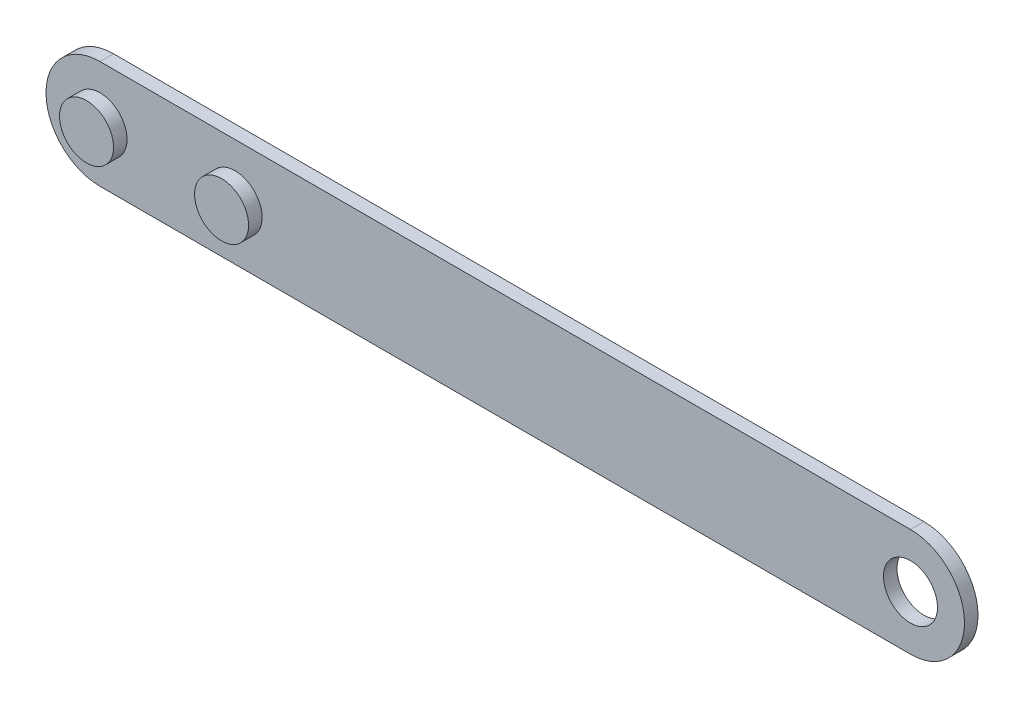
ISO-10303-21;
HEADER;
FILE_DESCRIPTION(('STEP AP214'),'2;1');
FILE_NAME('part.step','',(''),(''),'','','');
FILE_SCHEMA(('AUTOMOTIVE_DESIGN { 1 0 10303 214 1 1 1 1 }'));
ENDSEC;
DATA;
#1=APPLICATION_CONTEXT('core data for automotive mechanical design processes');
#2=APPLICATION_PROTOCOL_DEFINITION('international standard','automotive_design',2000,#1);
#3=PRODUCT_CONTEXT('',#1,'mechanical');
#4=PRODUCT('Part','Part','',(#3));
#5=PRODUCT_RELATED_PRODUCT_CATEGORY('part','',(#4));
#6=PRODUCT_DEFINITION_FORMATION('','',#4);
#7=PRODUCT_DEFINITION_CONTEXT('part definition',#1,'design');
#8=PRODUCT_DEFINITION('design','',#6,#7);
#9=PRODUCT_DEFINITION_SHAPE('','',#8);
#10=(LENGTH_UNIT() NAMED_UNIT(*) SI_UNIT(.MILLI.,.METRE.));
#11=(NAMED_UNIT(*) PLANE_ANGLE_UNIT() SI_UNIT($,.RADIAN.));
#12=(NAMED_UNIT(*) SI_UNIT($,.STERADIAN.) SOLID_ANGLE_UNIT());
#13=UNCERTAINTY_MEASURE_WITH_UNIT(LENGTH_MEASURE(1.E-05),#10,'distance_accuracy_value','');
#14=(GEOMETRIC_REPRESENTATION_CONTEXT(3) GLOBAL_UNCERTAINTY_ASSIGNED_CONTEXT((#13)) GLOBAL_UNIT_ASSIGNED_CONTEXT((#10,
#11,#12)) REPRESENTATION_CONTEXT('',''));
#15=CARTESIAN_POINT('',(0.,0.,0.));
#16=DIRECTION('',(0.,0.,1.));
#17=DIRECTION('',(1.,0.,0.));
#18=AXIS2_PLACEMENT_3D('',#15,#16,#17);
#19=CARTESIAN_POINT('',(0.,0.,5.));
#20=DIRECTION('',(0.,0.,1.));
#21=DIRECTION('',(1.,0.,0.));
#22=AXIS2_PLACEMENT_3D('',#19,#20,#21);
#23=PLANE('',#22);
#24=CARTESIAN_POINT('',(50.,0.,5.));
#25=DIRECTION('',(0.,0.,1.));
#26=DIRECTION('',(1.,0.,0.));
#27=AXIS2_PLACEMENT_3D('',#24,#25,#26);
#28=CIRCLE('',#27,10.);
#29=CARTESIAN_POINT('',(60.,0.,5.));
#30=VERTEX_POINT('',#29);
#31=EDGE_CURVE('E146',#30,#30,#28,.T.);
#32=ORIENTED_EDGE('',*,*,#31,.F.);
#33=EDGE_LOOP('',(#32));
#34=FACE_BOUND('',#33,.T.);
#35=CARTESIAN_POINT('',(0.,0.,5.));
#36=DIRECTION('',(0.,0.,1.));
#37=DIRECTION('',(1.,0.,0.));
#38=AXIS2_PLACEMENT_3D('',#35,#36,#37);
#39=CIRCLE('',#38,10.);
#40=CARTESIAN_POINT('',(10.,0.,5.));
#41=VERTEX_POINT('',#40);
#42=EDGE_CURVE('E138',#41,#41,#39,.T.);
#43=ORIENTED_EDGE('',*,*,#42,.F.);
#44=EDGE_LOOP('',(#43));
#45=FACE_BOUND('',#44,.T.);
#46=CARTESIAN_POINT('',(0.,0.,5.));
#47=DIRECTION('',(0.,0.,1.));
#48=DIRECTION('',(1.,0.,0.));
#49=AXIS2_PLACEMENT_3D('',#46,#47,#48);
#50=CIRCLE('',#49,20.);
#51=CARTESIAN_POINT('',(0.,20.,5.));
#52=VERTEX_POINT('',#51);
#53=CARTESIAN_POINT('',(0.,-20.,5.));
#54=VERTEX_POINT('',#53);
#55=EDGE_CURVE('E92',#52,#54,#50,.T.);
#56=ORIENTED_EDGE('',*,*,#55,.T.);
#57=DIRECTION('',(1.,0.,0.));
#58=VECTOR('',#57,1.);
#59=CARTESIAN_POINT('',(0.,-20.,5.));
#60=LINE('',#59,#58);
#61=CARTESIAN_POINT('',(300.,-20.,5.));
#62=VERTEX_POINT('',#61);
#63=EDGE_CURVE('E87',#54,#62,#60,.T.);
#64=ORIENTED_EDGE('',*,*,#63,.T.);
#65=CARTESIAN_POINT('',(300.,0.,5.));
#66=DIRECTION('',(0.,0.,1.));
#67=DIRECTION('',(1.,0.,0.));
#68=AXIS2_PLACEMENT_3D('',#65,#66,#67);
#69=CIRCLE('',#68,20.);
#70=CARTESIAN_POINT('',(300.,20.,5.));
#71=VERTEX_POINT('',#70);
#72=EDGE_CURVE('E90',#62,#71,#69,.T.);
#73=ORIENTED_EDGE('',*,*,#72,.T.);
#74=DIRECTION('',(-1.,0.,0.));
#75=VECTOR('',#74,1.);
#76=CARTESIAN_POINT('',(0.,20.,5.));
#77=LINE('',#76,#75);
#78=EDGE_CURVE('E57',#71,#52,#77,.T.);
#79=ORIENTED_EDGE('',*,*,#78,.T.);
#80=EDGE_LOOP('',(#56,#64,#73,#79));
#81=FACE_BOUND('',#80,.T.);
#82=CARTESIAN_POINT('',(300.,0.,5.));
#83=DIRECTION('',(0.,0.,1.));
#84=DIRECTION('',(1.,0.,0.));
#85=AXIS2_PLACEMENT_3D('',#82,#83,#84);
#86=CIRCLE('',#85,9.99999999999998);
#87=CARTESIAN_POINT('',(310.,0.,5.));
#88=VERTEX_POINT('',#87);
#89=EDGE_CURVE('E112',#88,#88,#86,.T.);
#90=ORIENTED_EDGE('',*,*,#89,.F.);
#91=EDGE_LOOP('',(#90));
#92=FACE_BOUND('',#91,.T.);
#93=ADVANCED_FACE('F39',(#34,#45,#81,#92),#23,.T.);
#94=CARTESIAN_POINT('',(0.,0.,0.));
#95=DIRECTION('',(0.,0.,1.));
#96=DIRECTION('',(1.,0.,0.));
#97=AXIS2_PLACEMENT_3D('',#94,#95,#96);
#98=PLANE('',#97);
#99=CARTESIAN_POINT('',(0.,0.,0.));
#100=DIRECTION('',(0.,0.,1.));
#101=DIRECTION('',(1.,0.,0.));
#102=AXIS2_PLACEMENT_3D('',#99,#100,#101);
#103=CIRCLE('',#102,20.);
#104=CARTESIAN_POINT('',(0.,20.,0.));
#105=VERTEX_POINT('',#104);
#106=CARTESIAN_POINT('',(0.,-20.,0.));
#107=VERTEX_POINT('',#106);
#108=EDGE_CURVE('E108',#105,#107,#103,.T.);
#109=ORIENTED_EDGE('',*,*,#108,.F.);
#110=DIRECTION('',(-1.,0.,0.));
#111=VECTOR('',#110,1.);
#112=CARTESIAN_POINT('',(0.,20.,0.));
#113=LINE('',#112,#111);
#114=CARTESIAN_POINT('',(300.,20.,0.));
#115=VERTEX_POINT('',#114);
#116=EDGE_CURVE('E80',#115,#105,#113,.T.);
#117=ORIENTED_EDGE('',*,*,#116,.F.);
#118=CARTESIAN_POINT('',(300.,0.,0.));
#119=DIRECTION('',(0.,0.,1.));
#120=DIRECTION('',(1.,0.,0.));
#121=AXIS2_PLACEMENT_3D('',#118,#119,#120);
#122=CIRCLE('',#121,20.);
#123=CARTESIAN_POINT('',(300.,-20.,0.));
#124=VERTEX_POINT('',#123);
#125=EDGE_CURVE('E74',#124,#115,#122,.T.);
#126=ORIENTED_EDGE('',*,*,#125,.F.);
#127=DIRECTION('',(1.,0.,0.));
#128=VECTOR('',#127,1.);
#129=CARTESIAN_POINT('',(0.,-20.,0.));
#130=LINE('',#129,#128);
#131=EDGE_CURVE('E97',#107,#124,#130,.T.);
#132=ORIENTED_EDGE('',*,*,#131,.F.);
#133=EDGE_LOOP('',(#109,#117,#126,#132));
#134=FACE_BOUND('',#133,.T.);
#135=CARTESIAN_POINT('',(300.,0.,0.));
#136=DIRECTION('',(0.,0.,1.));
#137=DIRECTION('',(1.,0.,0.));
#138=AXIS2_PLACEMENT_3D('',#135,#136,#137);
#139=CIRCLE('',#138,9.99999999999998);
#140=CARTESIAN_POINT('',(310.,0.,0.));
#141=VERTEX_POINT('',#140);
#142=EDGE_CURVE('E130',#141,#141,#139,.T.);
#143=ORIENTED_EDGE('',*,*,#142,.T.);
#144=EDGE_LOOP('',(#143));
#145=FACE_BOUND('',#144,.T.);
#146=ADVANCED_FACE('F125',(#134,#145),#98,.F.);
#147=CARTESIAN_POINT('',(0.,0.,5.));
#148=DIRECTION('',(0.,0.,-1.));
#149=DIRECTION('',(-1.,0.,0.));
#150=AXIS2_PLACEMENT_3D('',#147,#148,#149);
#151=CYLINDRICAL_SURFACE('',#150,20.);
#152=ORIENTED_EDGE('',*,*,#108,.T.);
#153=DIRECTION('',(0.,0.,-1.));
#154=VECTOR('',#153,1.);
#155=CARTESIAN_POINT('',(0.,-20.,5.));
#156=LINE('',#155,#154);
#157=EDGE_CURVE('E11',#54,#107,#156,.T.);
#158=ORIENTED_EDGE('',*,*,#157,.F.);
#159=ORIENTED_EDGE('',*,*,#55,.F.);
#160=DIRECTION('',(0.,0.,-1.));
#161=VECTOR('',#160,1.);
#162=CARTESIAN_POINT('',(0.,20.,5.));
#163=LINE('',#162,#161);
#164=EDGE_CURVE('E104',#52,#105,#163,.T.);
#165=ORIENTED_EDGE('',*,*,#164,.T.);
#166=EDGE_LOOP('',(#152,#158,#159,#165));
#167=FACE_BOUND('',#166,.T.);
#168=ADVANCED_FACE('F41',(#167),#151,.T.);
#169=CARTESIAN_POINT('',(0.,-20.,5.));
#170=DIRECTION('',(0.,1.,0.));
#171=DIRECTION('',(0.,0.,1.));
#172=AXIS2_PLACEMENT_3D('',#169,#170,#171);
#173=PLANE('',#172);
#174=ORIENTED_EDGE('',*,*,#131,.T.);
#175=DIRECTION('',(0.,0.,-1.));
#176=VECTOR('',#175,1.);
#177=CARTESIAN_POINT('',(300.,-20.,5.));
#178=LINE('',#177,#176);
#179=EDGE_CURVE('E49',#62,#124,#178,.T.);
#180=ORIENTED_EDGE('',*,*,#179,.F.);
#181=ORIENTED_EDGE('',*,*,#63,.F.);
#182=ORIENTED_EDGE('',*,*,#157,.T.);
#183=EDGE_LOOP('',(#174,#180,#181,#182));
#184=FACE_BOUND('',#183,.T.);
#185=ADVANCED_FACE('F96',(#184),#173,.F.);
#186=CARTESIAN_POINT('',(300.,0.,5.));
#187=DIRECTION('',(0.,0.,-1.));
#188=DIRECTION('',(-1.,0.,0.));
#189=AXIS2_PLACEMENT_3D('',#186,#187,#188);
#190=CYLINDRICAL_SURFACE('',#189,20.);
#191=ORIENTED_EDGE('',*,*,#125,.T.);
#192=DIRECTION('',(0.,0.,-1.));
#193=VECTOR('',#192,1.);
#194=CARTESIAN_POINT('',(300.,20.,5.));
#195=LINE('',#194,#193);
#196=EDGE_CURVE('E99',#71,#115,#195,.T.);
#197=ORIENTED_EDGE('',*,*,#196,.F.);
#198=ORIENTED_EDGE('',*,*,#72,.F.);
#199=ORIENTED_EDGE('',*,*,#179,.T.);
#200=EDGE_LOOP('',(#191,#197,#198,#199));
#201=FACE_BOUND('',#200,.T.);
#202=ADVANCED_FACE('F100',(#201),#190,.T.);
#203=CARTESIAN_POINT('',(0.,20.,5.));
#204=DIRECTION('',(0.,-1.,0.));
#205=DIRECTION('',(0.,0.,-1.));
#206=AXIS2_PLACEMENT_3D('',#203,#204,#205);
#207=PLANE('',#206);
#208=ORIENTED_EDGE('',*,*,#116,.T.);
#209=ORIENTED_EDGE('',*,*,#164,.F.);
#210=ORIENTED_EDGE('',*,*,#78,.F.);
#211=ORIENTED_EDGE('',*,*,#196,.T.);
#212=EDGE_LOOP('',(#208,#209,#210,#211));
#213=FACE_BOUND('',#212,.T.);
#214=ADVANCED_FACE('F122',(#213),#207,.F.);
#215=CARTESIAN_POINT('',(300.,0.,5.));
#216=DIRECTION('',(0.,0.,-1.));
#217=DIRECTION('',(-1.,0.,0.));
#218=AXIS2_PLACEMENT_3D('',#215,#216,#217);
#219=CYLINDRICAL_SURFACE('',#218,9.99999999999998);
#220=ORIENTED_EDGE('',*,*,#89,.T.);
#221=EDGE_LOOP('',(#220));
#222=FACE_BOUND('',#221,.T.);
#223=ORIENTED_EDGE('',*,*,#142,.F.);
#224=EDGE_LOOP('',(#223));
#225=FACE_BOUND('',#224,.T.);
#226=ADVANCED_FACE('F170',(#222,#225),#219,.F.);
#227=CARTESIAN_POINT('',(0.,0.,10.));
#228=DIRECTION('',(0.,0.,-1.));
#229=DIRECTION('',(-1.,0.,0.));
#230=AXIS2_PLACEMENT_3D('',#227,#228,#229);
#231=CYLINDRICAL_SURFACE('',#230,10.);
#232=CARTESIAN_POINT('',(0.,0.,10.));
#233=DIRECTION('',(0.,0.,1.));
#234=DIRECTION('',(1.,0.,0.));
#235=AXIS2_PLACEMENT_3D('',#232,#233,#234);
#236=CIRCLE('',#235,10.);
#237=CARTESIAN_POINT('',(10.,0.,10.));
#238=VERTEX_POINT('',#237);
#239=EDGE_CURVE('E134',#238,#238,#236,.T.);
#240=ORIENTED_EDGE('',*,*,#239,.F.);
#241=EDGE_LOOP('',(#240));
#242=FACE_BOUND('',#241,.T.);
#243=ORIENTED_EDGE('',*,*,#42,.T.);
#244=EDGE_LOOP('',(#243));
#245=FACE_BOUND('',#244,.T.);
#246=ADVANCED_FACE('F168',(#242,#245),#231,.T.);
#247=CARTESIAN_POINT('',(0.,0.,10.));
#248=DIRECTION('',(0.,0.,1.));
#249=DIRECTION('',(1.,0.,0.));
#250=AXIS2_PLACEMENT_3D('',#247,#248,#249);
#251=PLANE('',#250);
#252=ORIENTED_EDGE('',*,*,#239,.T.);
#253=EDGE_LOOP('',(#252));
#254=FACE_BOUND('',#253,.T.);
#255=ADVANCED_FACE('F159',(#254),#251,.T.);
#256=CARTESIAN_POINT('',(50.,0.,10.));
#257=DIRECTION('',(0.,0.,-1.));
#258=DIRECTION('',(-1.,0.,0.));
#259=AXIS2_PLACEMENT_3D('',#256,#257,#258);
#260=CYLINDRICAL_SURFACE('',#259,10.);
#261=CARTESIAN_POINT('',(50.,0.,10.));
#262=DIRECTION('',(0.,0.,1.));
#263=DIRECTION('',(1.,0.,0.));
#264=AXIS2_PLACEMENT_3D('',#261,#262,#263);
#265=CIRCLE('',#264,10.);
#266=CARTESIAN_POINT('',(60.,0.,10.));
#267=VERTEX_POINT('',#266);
#268=EDGE_CURVE('E142',#267,#267,#265,.T.);
#269=ORIENTED_EDGE('',*,*,#268,.F.);
#270=EDGE_LOOP('',(#269));
#271=FACE_BOUND('',#270,.T.);
#272=ORIENTED_EDGE('',*,*,#31,.T.);
#273=EDGE_LOOP('',(#272));
#274=FACE_BOUND('',#273,.T.);
#275=ADVANCED_FACE('F156',(#271,#274),#260,.T.);
#276=CARTESIAN_POINT('',(50.,0.,10.));
#277=DIRECTION('',(0.,0.,1.));
#278=DIRECTION('',(1.,0.,0.));
#279=AXIS2_PLACEMENT_3D('',#276,#277,#278);
#280=PLANE('',#279);
#281=ORIENTED_EDGE('',*,*,#268,.T.);
#282=EDGE_LOOP('',(#281));
#283=FACE_BOUND('',#282,.T.);
#284=ADVANCED_FACE('F154',(#283),#280,.T.);
#285=CLOSED_SHELL('',(#93,#146,#168,#185,#202,#214,#226,#246,#255,#275,#284));
#286=MANIFOLD_SOLID_BREP('B2',#285);
#287=ADVANCED_BREP_SHAPE_REPRESENTATION('',(#18,#286),#14);
#288=SHAPE_DEFINITION_REPRESENTATION(#9,#287);
ENDSEC;
END-ISO-10303-21;
